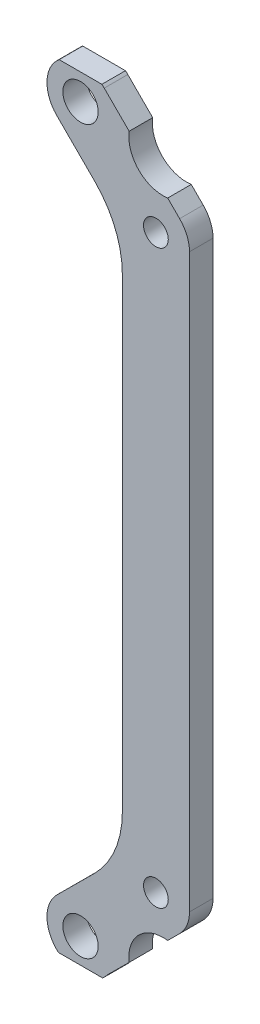
ISO-10303-21;
HEADER;
FILE_DESCRIPTION(('STEP AP214'),'2;1');
FILE_NAME('part.step','',(''),(''),'','','');
FILE_SCHEMA(('AUTOMOTIVE_DESIGN { 1 0 10303 214 1 1 1 1 }'));
ENDSEC;
DATA;
#1=APPLICATION_CONTEXT('core data for automotive mechanical design processes');
#2=APPLICATION_PROTOCOL_DEFINITION('international standard','automotive_design',2000,#1);
#3=PRODUCT_CONTEXT('',#1,'mechanical');
#4=PRODUCT('Part','Part','',(#3));
#5=PRODUCT_RELATED_PRODUCT_CATEGORY('part','',(#4));
#6=PRODUCT_DEFINITION_FORMATION('','',#4);
#7=PRODUCT_DEFINITION_CONTEXT('part definition',#1,'design');
#8=PRODUCT_DEFINITION('design','',#6,#7);
#9=PRODUCT_DEFINITION_SHAPE('','',#8);
#10=(LENGTH_UNIT() NAMED_UNIT(*) SI_UNIT(.MILLI.,.METRE.));
#11=(NAMED_UNIT(*) PLANE_ANGLE_UNIT() SI_UNIT($,.RADIAN.));
#12=(NAMED_UNIT(*) SI_UNIT($,.STERADIAN.) SOLID_ANGLE_UNIT());
#13=UNCERTAINTY_MEASURE_WITH_UNIT(LENGTH_MEASURE(1.E-05),#10,'distance_accuracy_value','');
#14=(GEOMETRIC_REPRESENTATION_CONTEXT(3) GLOBAL_UNCERTAINTY_ASSIGNED_CONTEXT((#13)) GLOBAL_UNIT_ASSIGNED_CONTEXT((#10,
#11,#12)) REPRESENTATION_CONTEXT('',''));
#15=CARTESIAN_POINT('',(0.,0.,0.));
#16=DIRECTION('',(0.,0.,1.));
#17=DIRECTION('',(1.,0.,0.));
#18=AXIS2_PLACEMENT_3D('',#15,#16,#17);
#19=CARTESIAN_POINT('',(43.5738675976098,-31.0495528823525,2.));
#20=DIRECTION('',(0.,0.,-1.));
#21=DIRECTION('',(-1.,0.,0.));
#22=AXIS2_PLACEMENT_3D('',#19,#20,#21);
#23=CYLINDRICAL_SURFACE('',#22,2.85);
#24=CARTESIAN_POINT('',(43.5738675976098,-31.0495528823525,2.));
#25=DIRECTION('',(0.,0.,1.));
#26=DIRECTION('',(1.,0.,0.));
#27=AXIS2_PLACEMENT_3D('',#24,#25,#26);
#28=CIRCLE('',#27,2.85);
#29=CARTESIAN_POINT('',(45.4495833368332,-33.19529062626,2.));
#30=VERTEX_POINT('',#29);
#31=CARTESIAN_POINT('',(45.8565070510267,-32.7560279409761,2.));
#32=VERTEX_POINT('',#31);
#33=EDGE_CURVE('E211',#30,#32,#28,.T.);
#34=ORIENTED_EDGE('',*,*,#33,.F.);
#35=DIRECTION('',(0.,0.,-1.));
#36=VECTOR('',#35,1.);
#37=CARTESIAN_POINT('',(45.4495833368332,-33.19529062626,2.));
#38=LINE('',#37,#36);
#39=CARTESIAN_POINT('',(45.4495833368332,-33.19529062626,0.));
#40=VERTEX_POINT('',#39);
#41=EDGE_CURVE('E12',#30,#40,#38,.T.);
#42=ORIENTED_EDGE('',*,*,#41,.T.);
#43=CARTESIAN_POINT('',(43.5738675976098,-31.0495528823525,0.));
#44=DIRECTION('',(0.,0.,1.));
#45=DIRECTION('',(1.,0.,0.));
#46=AXIS2_PLACEMENT_3D('',#43,#44,#45);
#47=CIRCLE('',#46,2.85);
#48=CARTESIAN_POINT('',(45.8565070510267,-32.7560279409761,0.));
#49=VERTEX_POINT('',#48);
#50=EDGE_CURVE('E205',#40,#49,#47,.T.);
#51=ORIENTED_EDGE('',*,*,#50,.T.);
#52=DIRECTION('',(0.,0.,-1.));
#53=VECTOR('',#52,1.);
#54=CARTESIAN_POINT('',(45.8565070510267,-32.7560279409761,2.));
#55=LINE('',#54,#53);
#56=EDGE_CURVE('E218',#49,#32,#55,.F.);
#57=ORIENTED_EDGE('',*,*,#56,.T.);
#58=EDGE_LOOP('',(#34,#42,#51,#57));
#59=FACE_BOUND('',#58,.T.);
#60=ADVANCED_FACE('F56',(#59),#23,.T.);
#61=CARTESIAN_POINT('',(43.5738675976098,30.2904471176475,2.));
#62=DIRECTION('',(0.,0.,-1.));
#63=DIRECTION('',(-1.,0.,0.));
#64=AXIS2_PLACEMENT_3D('',#61,#62,#63);
#65=CYLINDRICAL_SURFACE('',#64,2.85);
#66=CARTESIAN_POINT('',(43.5738675976098,30.2904471176475,2.));
#67=DIRECTION('',(0.,0.,1.));
#68=DIRECTION('',(1.,0.,0.));
#69=AXIS2_PLACEMENT_3D('',#66,#67,#68);
#70=CIRCLE('',#69,2.85);
#71=CARTESIAN_POINT('',(41.7590941210451,32.4879678180636,2.));
#72=VERTEX_POINT('',#71);
#73=CARTESIAN_POINT('',(41.5623623184378,28.2714507055993,2.));
#74=VERTEX_POINT('',#73);
#75=EDGE_CURVE('E287',#72,#74,#70,.T.);
#76=ORIENTED_EDGE('',*,*,#75,.F.);
#77=DIRECTION('',(0.,0.,-1.));
#78=VECTOR('',#77,1.);
#79=CARTESIAN_POINT('',(41.7590941210451,32.4879678180636,2.));
#80=LINE('',#79,#78);
#81=CARTESIAN_POINT('',(41.7590941210451,32.4879678180636,0.));
#82=VERTEX_POINT('',#81);
#83=EDGE_CURVE('E196',#72,#82,#80,.T.);
#84=ORIENTED_EDGE('',*,*,#83,.T.);
#85=CARTESIAN_POINT('',(43.5738675976098,30.2904471176475,0.));
#86=DIRECTION('',(0.,0.,1.));
#87=DIRECTION('',(1.,0.,0.));
#88=AXIS2_PLACEMENT_3D('',#85,#86,#87);
#89=CIRCLE('',#88,2.85);
#90=CARTESIAN_POINT('',(41.5623623184378,28.2714507055993,0.));
#91=VERTEX_POINT('',#90);
#92=EDGE_CURVE('E285',#82,#91,#89,.T.);
#93=ORIENTED_EDGE('',*,*,#92,.T.);
#94=DIRECTION('',(0.,0.,-1.));
#95=VECTOR('',#94,1.);
#96=CARTESIAN_POINT('',(41.5623623184378,28.2714507055993,2.));
#97=LINE('',#96,#95);
#98=EDGE_CURVE('E356',#74,#91,#97,.T.);
#99=ORIENTED_EDGE('',*,*,#98,.F.);
#100=EDGE_LOOP('',(#76,#84,#93,#99));
#101=FACE_BOUND('',#100,.T.);
#102=ADVANCED_FACE('F283',(#101),#65,.T.);
#103=CARTESIAN_POINT('',(39.1506076425324,-39.416663632518,2.));
#104=DIRECTION('',(0.704708232186591,-0.709497221621375,0.));
#105=DIRECTION('',(0.709497221621375,0.704708232186591,0.));
#106=AXIS2_PLACEMENT_3D('',#103,#104,#105);
#107=PLANE('',#106);
#108=DIRECTION('',(0.,0.,-1.));
#109=VECTOR('',#108,1.);
#110=CARTESIAN_POINT('',(47.698469833806,-30.926498103721,2.));
#111=LINE('',#110,#109);
#112=CARTESIAN_POINT('',(47.698469833806,-30.926498103721,2.));
#113=VERTEX_POINT('',#112);
#114=CARTESIAN_POINT('',(47.698469833806,-30.926498103721,0.));
#115=VERTEX_POINT('',#114);
#116=EDGE_CURVE('E390',#113,#115,#111,.T.);
#117=ORIENTED_EDGE('',*,*,#116,.F.);
#118=DIRECTION('',(-0.709497221621375,-0.704708232186591,0.));
#119=VECTOR('',#118,1.);
#120=CARTESIAN_POINT('',(39.1506076425324,-39.416663632518,2.));
#121=LINE('',#120,#119);
#122=EDGE_CURVE('E236',#113,#32,#121,.T.);
#123=ORIENTED_EDGE('',*,*,#122,.T.);
#124=ORIENTED_EDGE('',*,*,#56,.F.);
#125=DIRECTION('',(-0.709497221621375,-0.704708232186591,0.));
#126=VECTOR('',#125,1.);
#127=CARTESIAN_POINT('',(39.1506076425324,-39.416663632518,0.));
#128=LINE('',#127,#126);
#129=EDGE_CURVE('E231',#115,#49,#128,.T.);
#130=ORIENTED_EDGE('',*,*,#129,.F.);
#131=EDGE_LOOP('',(#117,#123,#124,#130));
#132=FACE_BOUND('',#131,.T.);
#133=ADVANCED_FACE('F389',(#132),#107,.T.);
#134=CARTESIAN_POINT('',(38.9474116840103,38.9474116840103,2.));
#135=DIRECTION('',(-0.707106781186547,-0.707106781186547,0.));
#136=DIRECTION('',(0.707106781186548,-0.707106781186548,0.));
#137=AXIS2_PLACEMENT_3D('',#134,#135,#136);
#138=PLANE('',#137);
#139=DIRECTION('',(-0.707106781186548,0.707106781186548,0.));
#140=VECTOR('',#139,1.);
#141=CARTESIAN_POINT('',(38.9474116840103,38.9474116840103,2.));
#142=LINE('',#141,#140);
#143=CARTESIAN_POINT('',(47.7019282514283,30.1928951165923,2.));
#144=VERTEX_POINT('',#143);
#145=CARTESIAN_POINT('',(45.5891219239914,32.3057014440292,2.));
#146=VERTEX_POINT('',#145);
#147=EDGE_CURVE('E328',#144,#146,#142,.T.);
#148=ORIENTED_EDGE('',*,*,#147,.F.);
#149=DIRECTION('',(0.,0.,-1.));
#150=VECTOR('',#149,1.);
#151=CARTESIAN_POINT('',(47.7019282514283,30.1928951165923,2.));
#152=LINE('',#151,#150);
#153=CARTESIAN_POINT('',(47.7019282514283,30.1928951165923,0.));
#154=VERTEX_POINT('',#153);
#155=EDGE_CURVE('E243',#144,#154,#152,.T.);
#156=ORIENTED_EDGE('',*,*,#155,.T.);
#157=DIRECTION('',(-0.707106781186548,0.707106781186548,0.));
#158=VECTOR('',#157,1.);
#159=CARTESIAN_POINT('',(38.9474116840103,38.9474116840103,0.));
#160=LINE('',#159,#158);
#161=CARTESIAN_POINT('',(45.5891219239914,32.3057014440292,0.));
#162=VERTEX_POINT('',#161);
#163=EDGE_CURVE('E339',#154,#162,#160,.T.);
#164=ORIENTED_EDGE('',*,*,#163,.T.);
#165=DIRECTION('',(0.,0.,-1.));
#166=VECTOR('',#165,1.);
#167=CARTESIAN_POINT('',(45.5891219239914,32.3057014440292,2.));
#168=LINE('',#167,#166);
#169=EDGE_CURVE('E353',#146,#162,#168,.T.);
#170=ORIENTED_EDGE('',*,*,#169,.F.);
#171=EDGE_LOOP('',(#148,#156,#164,#170));
#172=FACE_BOUND('',#171,.T.);
#173=ADVANCED_FACE('F423',(#172),#138,.F.);
#174=DIRECTION('',(0.,0.,-1.));
#175=VECTOR('',#174,1.);
#176=CARTESIAN_POINT('',(50.970278135918,-27.6767739689799,2.));
#177=LINE('',#176,#175);
#178=CARTESIAN_POINT('',(50.970278135918,-27.6767739689799,0.));
#179=VERTEX_POINT('',#178);
#180=CARTESIAN_POINT('',(50.970278135918,-27.6767739689799,2.));
#181=VERTEX_POINT('',#180);
#182=EDGE_CURVE('E394',#179,#181,#177,.F.);
#183=ORIENTED_EDGE('',*,*,#182,.F.);
#184=CARTESIAN_POINT('',(51.9754271636713,-26.6784095316768,0.));
#185=VERTEX_POINT('',#184);
#186=EDGE_CURVE('E227',#185,#179,#128,.T.);
#187=ORIENTED_EDGE('',*,*,#186,.F.);
#188=DIRECTION('',(0.,0.,-1.));
#189=VECTOR('',#188,1.);
#190=CARTESIAN_POINT('',(51.9754271636718,-26.6784095316763,2.));
#191=LINE('',#190,#189);
#192=CARTESIAN_POINT('',(51.9754271636713,-26.6784095316768,2.));
#193=VERTEX_POINT('',#192);
#194=EDGE_CURVE('E222',#185,#193,#191,.F.);
#195=ORIENTED_EDGE('',*,*,#194,.T.);
#196=EDGE_CURVE('E232',#193,#181,#121,.T.);
#197=ORIENTED_EDGE('',*,*,#196,.T.);
#198=EDGE_LOOP('',(#183,#187,#195,#197));
#199=FACE_BOUND('',#198,.T.);
#200=ADVANCED_FACE('F398',(#199),#107,.T.);
#201=CARTESIAN_POINT('',(43.5738675976098,-31.0495528823525,2.));
#202=DIRECTION('',(0.,0.,1.));
#203=DIRECTION('',(1.,0.,0.));
#204=AXIS2_PLACEMENT_3D('',#201,#202,#203);
#205=PLANE('',#204);
#206=DIRECTION('',(-1.,0.,0.));
#207=VECTOR('',#206,1.);
#208=CARTESIAN_POINT('',(43.5738675976098,-33.19529062626,2.));
#209=LINE('',#208,#207);
#210=CARTESIAN_POINT('',(41.6981518583863,-33.19529062626,2.));
#211=VERTEX_POINT('',#210);
#212=EDGE_CURVE('E71',#30,#211,#209,.T.);
#213=ORIENTED_EDGE('',*,*,#212,.F.);
#214=ORIENTED_EDGE('',*,*,#33,.T.);
#215=ORIENTED_EDGE('',*,*,#122,.F.);
#216=CARTESIAN_POINT('',(50.5738675976098,-30.5495528823525,2.));
#217=DIRECTION('',(0.,0.,-1.));
#218=DIRECTION('',(-1.,0.,0.));
#219=AXIS2_PLACEMENT_3D('',#216,#217,#218);
#220=CIRCLE('',#219,2.9);
#221=EDGE_CURVE('E253',#113,#181,#220,.T.);
#222=ORIENTED_EDGE('',*,*,#221,.T.);
#223=ORIENTED_EDGE('',*,*,#196,.F.);
#224=CARTESIAN_POINT('',(49.9738675976098,-24.6495528823525,2.));
#225=DIRECTION('',(0.,0.,-1.));
#226=DIRECTION('',(-1.,0.,0.));
#227=AXIS2_PLACEMENT_3D('',#224,#225,#226);
#228=CIRCLE('',#227,2.85);
#229=CARTESIAN_POINT('',(52.8238675976098,-24.6495528823525,2.));
#230=VERTEX_POINT('',#229);
#231=EDGE_CURVE('E235',#230,#193,#228,.T.);
#232=ORIENTED_EDGE('',*,*,#231,.F.);
#233=DIRECTION('',(0.,1.,0.));
#234=VECTOR('',#233,1.);
#235=CARTESIAN_POINT('',(52.8238675976098,0.,2.));
#236=LINE('',#235,#234);
#237=CARTESIAN_POINT('',(52.8238675976098,23.8904471176475,2.));
#238=VERTEX_POINT('',#237);
#239=EDGE_CURVE('E332',#230,#238,#236,.T.);
#240=ORIENTED_EDGE('',*,*,#239,.T.);
#241=CARTESIAN_POINT('',(49.9738675976098,23.8904471176475,2.));
#242=DIRECTION('',(0.,0.,1.));
#243=DIRECTION('',(1.,0.,0.));
#244=AXIS2_PLACEMENT_3D('',#241,#242,#243);
#245=CIRCLE('',#244,2.85);
#246=CARTESIAN_POINT('',(51.9891219239914,25.9057014440292,2.));
#247=VERTEX_POINT('',#246);
#248=EDGE_CURVE('E312',#238,#247,#245,.T.);
#249=ORIENTED_EDGE('',*,*,#248,.T.);
#250=CARTESIAN_POINT('',(50.9763155965546,26.918507771466,2.));
#251=VERTEX_POINT('',#250);
#252=EDGE_CURVE('E329',#247,#251,#142,.T.);
#253=ORIENTED_EDGE('',*,*,#252,.T.);
#254=CARTESIAN_POINT('',(50.5738675976098,29.7904471176475,2.));
#255=DIRECTION('',(0.,0.,-1.));
#256=DIRECTION('',(-1.,0.,0.));
#257=AXIS2_PLACEMENT_3D('',#254,#255,#256);
#258=CIRCLE('',#257,2.9);
#259=EDGE_CURVE('E296',#251,#144,#258,.T.);
#260=ORIENTED_EDGE('',*,*,#259,.T.);
#261=ORIENTED_EDGE('',*,*,#147,.T.);
#262=CARTESIAN_POINT('',(45.3886410741744,32.4879678180636,2.));
#263=VERTEX_POINT('',#262);
#264=EDGE_CURVE('E303',#146,#263,#70,.T.);
#265=ORIENTED_EDGE('',*,*,#264,.T.);
#266=DIRECTION('',(1.,0.,0.));
#267=VECTOR('',#266,1.);
#268=CARTESIAN_POINT('',(43.5738675976098,32.4879678180636,2.));
#269=LINE('',#268,#267);
#270=EDGE_CURVE('E79',#72,#263,#269,.T.);
#271=ORIENTED_EDGE('',*,*,#270,.F.);
#272=ORIENTED_EDGE('',*,*,#75,.T.);
#273=DIRECTION('',(-0.707106396386645,0.707107165986241,0.));
#274=VECTOR('',#273,1.);
#275=CARTESIAN_POINT('',(34.9169291297944,34.9168911269912,2.));
#276=LINE('',#275,#274);
#277=CARTESIAN_POINT('',(44.7807249254997,25.0530845957399,2.));
#278=VERTEX_POINT('',#277);
#279=EDGE_CURVE('E325',#278,#74,#276,.T.);
#280=ORIENTED_EDGE('',*,*,#279,.F.);
#281=CARTESIAN_POINT('',(39.1238675976098,19.3962334246467,2.));
#282=DIRECTION('',(0.,0.,1.));
#283=DIRECTION('',(1.,0.,0.));
#284=AXIS2_PLACEMENT_3D('',#281,#282,#283);
#285=CIRCLE('',#284,8.);
#286=CARTESIAN_POINT('',(47.1238675976098,19.3962334246467,2.));
#287=VERTEX_POINT('',#286);
#288=EDGE_CURVE('E265',#278,#287,#285,.F.);
#289=ORIENTED_EDGE('',*,*,#288,.T.);
#290=DIRECTION('',(0.,1.,0.));
#291=VECTOR('',#290,1.);
#292=CARTESIAN_POINT('',(47.1238675976098,0.,2.));
#293=LINE('',#292,#291);
#294=CARTESIAN_POINT('',(47.1238675976098,-20.1672643470321,2.));
#295=VERTEX_POINT('',#294);
#296=EDGE_CURVE('E323',#295,#287,#293,.T.);
#297=ORIENTED_EDGE('',*,*,#296,.F.);
#298=CARTESIAN_POINT('',(39.1238675976098,-20.1672643470321,2.));
#299=DIRECTION('',(0.,0.,1.));
#300=DIRECTION('',(1.,0.,0.));
#301=AXIS2_PLACEMENT_3D('',#298,#299,#300);
#302=CIRCLE('',#301,8.);
#303=CARTESIAN_POINT('',(44.7701982058117,-25.8346226966411,2.));
#304=VERTEX_POINT('',#303);
#305=EDGE_CURVE('E275',#295,#304,#302,.F.);
#306=ORIENTED_EDGE('',*,*,#305,.T.);
#307=DIRECTION('',(0.708419793701119,0.705791326025238,0.));
#308=VECTOR('',#307,1.);
#309=CARTESIAN_POINT('',(35.2191111332785,-35.3502721319669,2.));
#310=LINE('',#309,#308);
#311=CARTESIAN_POINT('',(41.5623623184378,-29.0305564703043,2.));
#312=VERTEX_POINT('',#311);
#313=EDGE_CURVE('E239',#312,#304,#310,.T.);
#314=ORIENTED_EDGE('',*,*,#313,.F.);
#315=EDGE_CURVE('E213',#312,#211,#28,.T.);
#316=ORIENTED_EDGE('',*,*,#315,.T.);
#317=EDGE_LOOP('',(#213,#214,#215,#222,#223,#232,#240,#249,#253,#260,#261,#265,#271,#272,#280,
#289,#297,#306,#314,#316));
#318=FACE_BOUND('',#317,.T.);
#319=CARTESIAN_POINT('',(43.5738675976098,30.2904471176475,2.));
#320=DIRECTION('',(0.,0.,1.));
#321=DIRECTION('',(1.,0.,0.));
#322=AXIS2_PLACEMENT_3D('',#319,#320,#321);
#323=CIRCLE('',#322,1.5);
#324=CARTESIAN_POINT('',(45.0738675976098,30.2904471176475,2.));
#325=VERTEX_POINT('',#324);
#326=EDGE_CURVE('E258',#325,#325,#323,.T.);
#327=ORIENTED_EDGE('',*,*,#326,.F.);
#328=EDGE_LOOP('',(#327));
#329=FACE_BOUND('',#328,.T.);
#330=CARTESIAN_POINT('',(43.5738675976098,-31.0495528823525,2.));
#331=DIRECTION('',(0.,0.,1.));
#332=DIRECTION('',(1.,0.,0.));
#333=AXIS2_PLACEMENT_3D('',#330,#331,#332);
#334=CIRCLE('',#333,1.5);
#335=CARTESIAN_POINT('',(45.0738675976098,-31.0495528823525,2.));
#336=VERTEX_POINT('',#335);
#337=EDGE_CURVE('E254',#336,#336,#334,.T.);
#338=ORIENTED_EDGE('',*,*,#337,.F.);
#339=EDGE_LOOP('',(#338));
#340=FACE_BOUND('',#339,.T.);
#341=CARTESIAN_POINT('',(49.9738675976098,-24.6495528823525,2.));
#342=DIRECTION('',(0.,0.,1.));
#343=DIRECTION('',(1.,0.,0.));
#344=AXIS2_PLACEMENT_3D('',#341,#342,#343);
#345=CIRCLE('',#344,1.05);
#346=CARTESIAN_POINT('',(51.0238675976098,-24.6495528823525,2.));
#347=VERTEX_POINT('',#346);
#348=EDGE_CURVE('E226',#347,#347,#345,.T.);
#349=ORIENTED_EDGE('',*,*,#348,.F.);
#350=EDGE_LOOP('',(#349));
#351=FACE_BOUND('',#350,.T.);
#352=CARTESIAN_POINT('',(49.9738675976098,23.8904471176475,2.));
#353=DIRECTION('',(0.,0.,1.));
#354=DIRECTION('',(1.,0.,0.));
#355=AXIS2_PLACEMENT_3D('',#352,#353,#354);
#356=CIRCLE('',#355,1.05);
#357=CARTESIAN_POINT('',(51.0238675976098,23.8904471176475,2.));
#358=VERTEX_POINT('',#357);
#359=EDGE_CURVE('E305',#358,#358,#356,.T.);
#360=ORIENTED_EDGE('',*,*,#359,.F.);
#361=EDGE_LOOP('',(#360));
#362=FACE_BOUND('',#361,.T.);
#363=ADVANCED_FACE('F363',(#318,#329,#340,#351,#362),#205,.T.);
#364=CARTESIAN_POINT('',(43.5738675976098,-31.0495528823525,0.));
#365=DIRECTION('',(0.,0.,1.));
#366=DIRECTION('',(1.,0.,0.));
#367=AXIS2_PLACEMENT_3D('',#364,#365,#366);
#368=PLANE('',#367);
#369=CARTESIAN_POINT('',(43.5738675976098,30.2904471176475,0.));
#370=DIRECTION('',(0.,0.,1.));
#371=DIRECTION('',(1.,0.,0.));
#372=AXIS2_PLACEMENT_3D('',#369,#370,#371);
#373=CIRCLE('',#372,1.5);
#374=CARTESIAN_POINT('',(45.0738675976098,30.2904471176475,0.));
#375=VERTEX_POINT('',#374);
#376=EDGE_CURVE('E255',#375,#375,#373,.T.);
#377=ORIENTED_EDGE('',*,*,#376,.T.);
#378=EDGE_LOOP('',(#377));
#379=FACE_BOUND('',#378,.T.);
#380=CARTESIAN_POINT('',(43.5738675976098,-31.0495528823525,0.));
#381=DIRECTION('',(0.,0.,1.));
#382=DIRECTION('',(1.,0.,0.));
#383=AXIS2_PLACEMENT_3D('',#380,#381,#382);
#384=CIRCLE('',#383,1.5);
#385=CARTESIAN_POINT('',(45.0738675976098,-31.0495528823525,0.));
#386=VERTEX_POINT('',#385);
#387=EDGE_CURVE('E250',#386,#386,#384,.T.);
#388=ORIENTED_EDGE('',*,*,#387,.T.);
#389=EDGE_LOOP('',(#388));
#390=FACE_BOUND('',#389,.T.);
#391=ORIENTED_EDGE('',*,*,#50,.F.);
#392=DIRECTION('',(1.,0.,0.));
#393=VECTOR('',#392,1.);
#394=CARTESIAN_POINT('',(48.0156538394514,-33.19529062626,0.));
#395=LINE('',#394,#393);
#396=CARTESIAN_POINT('',(41.6981518583863,-33.19529062626,0.));
#397=VERTEX_POINT('',#396);
#398=EDGE_CURVE('E192',#397,#40,#395,.T.);
#399=ORIENTED_EDGE('',*,*,#398,.F.);
#400=CARTESIAN_POINT('',(41.5623623184378,-29.0305564703043,0.));
#401=VERTEX_POINT('',#400);
#402=EDGE_CURVE('E202',#401,#397,#47,.T.);
#403=ORIENTED_EDGE('',*,*,#402,.F.);
#404=DIRECTION('',(0.708419793701119,0.705791326025238,0.));
#405=VECTOR('',#404,1.);
#406=CARTESIAN_POINT('',(35.2191111332785,-35.3502721319669,0.));
#407=LINE('',#406,#405);
#408=CARTESIAN_POINT('',(44.7701982058117,-25.8346226966411,0.));
#409=VERTEX_POINT('',#408);
#410=EDGE_CURVE('E225',#401,#409,#407,.T.);
#411=ORIENTED_EDGE('',*,*,#410,.T.);
#412=CARTESIAN_POINT('',(39.1238675976098,-20.1672643470321,0.));
#413=DIRECTION('',(0.,0.,1.));
#414=DIRECTION('',(1.,0.,0.));
#415=AXIS2_PLACEMENT_3D('',#412,#413,#414);
#416=CIRCLE('',#415,8.);
#417=CARTESIAN_POINT('',(47.1238675976098,-20.1672643470321,0.));
#418=VERTEX_POINT('',#417);
#419=EDGE_CURVE('E273',#409,#418,#416,.T.);
#420=ORIENTED_EDGE('',*,*,#419,.T.);
#421=DIRECTION('',(0.,1.,0.));
#422=VECTOR('',#421,1.);
#423=CARTESIAN_POINT('',(47.1238675976098,0.,0.));
#424=LINE('',#423,#422);
#425=CARTESIAN_POINT('',(47.1238675976098,19.3962334246467,0.));
#426=VERTEX_POINT('',#425);
#427=EDGE_CURVE('E336',#418,#426,#424,.T.);
#428=ORIENTED_EDGE('',*,*,#427,.T.);
#429=CARTESIAN_POINT('',(39.1238675976098,19.3962334246467,0.));
#430=DIRECTION('',(0.,0.,1.));
#431=DIRECTION('',(1.,0.,0.));
#432=AXIS2_PLACEMENT_3D('',#429,#430,#431);
#433=CIRCLE('',#432,8.);
#434=CARTESIAN_POINT('',(44.7807249254997,25.0530845957399,0.));
#435=VERTEX_POINT('',#434);
#436=EDGE_CURVE('E263',#426,#435,#433,.T.);
#437=ORIENTED_EDGE('',*,*,#436,.T.);
#438=DIRECTION('',(-0.707106396386645,0.707107165986241,0.));
#439=VECTOR('',#438,1.);
#440=CARTESIAN_POINT('',(34.9169291297944,34.9168911269912,0.));
#441=LINE('',#440,#439);
#442=EDGE_CURVE('E293',#435,#91,#441,.T.);
#443=ORIENTED_EDGE('',*,*,#442,.T.);
#444=ORIENTED_EDGE('',*,*,#92,.F.);
#445=DIRECTION('',(-1.,0.,0.));
#446=VECTOR('',#445,1.);
#447=CARTESIAN_POINT('',(47.130867933701,32.4879678180636,0.));
#448=LINE('',#447,#446);
#449=CARTESIAN_POINT('',(45.3886410741744,32.4879678180636,0.));
#450=VERTEX_POINT('',#449);
#451=EDGE_CURVE('E290',#450,#82,#448,.T.);
#452=ORIENTED_EDGE('',*,*,#451,.F.);
#453=EDGE_CURVE('E295',#162,#450,#89,.T.);
#454=ORIENTED_EDGE('',*,*,#453,.F.);
#455=ORIENTED_EDGE('',*,*,#163,.F.);
#456=CARTESIAN_POINT('',(50.5738675976098,29.7904471176475,0.));
#457=DIRECTION('',(0.,0.,-1.));
#458=DIRECTION('',(-1.,0.,0.));
#459=AXIS2_PLACEMENT_3D('',#456,#457,#458);
#460=CIRCLE('',#459,2.9);
#461=CARTESIAN_POINT('',(50.9763155965546,26.918507771466,0.));
#462=VERTEX_POINT('',#461);
#463=EDGE_CURVE('E299',#462,#154,#460,.T.);
#464=ORIENTED_EDGE('',*,*,#463,.F.);
#465=CARTESIAN_POINT('',(51.9891219239914,25.9057014440292,0.));
#466=VERTEX_POINT('',#465);
#467=EDGE_CURVE('E340',#466,#462,#160,.T.);
#468=ORIENTED_EDGE('',*,*,#467,.F.);
#469=CARTESIAN_POINT('',(49.9738675976098,23.8904471176475,0.));
#470=DIRECTION('',(0.,0.,1.));
#471=DIRECTION('',(1.,0.,0.));
#472=AXIS2_PLACEMENT_3D('',#469,#470,#471);
#473=CIRCLE('',#472,2.85);
#474=CARTESIAN_POINT('',(52.8238675976098,23.8904471176475,0.));
#475=VERTEX_POINT('',#474);
#476=EDGE_CURVE('E308',#475,#466,#473,.T.);
#477=ORIENTED_EDGE('',*,*,#476,.F.);
#478=DIRECTION('',(0.,1.,0.));
#479=VECTOR('',#478,1.);
#480=CARTESIAN_POINT('',(52.8238675976098,0.,0.));
#481=LINE('',#480,#479);
#482=CARTESIAN_POINT('',(52.8238675976098,-24.6495528823525,0.));
#483=VERTEX_POINT('',#482);
#484=EDGE_CURVE('E343',#483,#475,#481,.T.);
#485=ORIENTED_EDGE('',*,*,#484,.F.);
#486=CARTESIAN_POINT('',(49.9738675976098,-24.6495528823525,0.));
#487=DIRECTION('',(0.,0.,1.));
#488=DIRECTION('',(1.,0.,0.));
#489=AXIS2_PLACEMENT_3D('',#486,#487,#488);
#490=CIRCLE('',#489,2.85);
#491=EDGE_CURVE('E230',#483,#185,#490,.F.);
#492=ORIENTED_EDGE('',*,*,#491,.T.);
#493=ORIENTED_EDGE('',*,*,#186,.T.);
#494=CARTESIAN_POINT('',(50.5738675976098,-30.5495528823525,0.));
#495=DIRECTION('',(0.,0.,1.));
#496=DIRECTION('',(1.,0.,0.));
#497=AXIS2_PLACEMENT_3D('',#494,#495,#496);
#498=CIRCLE('',#497,2.9);
#499=EDGE_CURVE('E246',#179,#115,#498,.T.);
#500=ORIENTED_EDGE('',*,*,#499,.T.);
#501=ORIENTED_EDGE('',*,*,#129,.T.);
#502=EDGE_LOOP('',(#391,#399,#403,#411,#420,#428,#437,#443,#444,#452,#454,#455,#464,#468,#477,
#485,#492,#493,#500,#501));
#503=FACE_BOUND('',#502,.T.);
#504=CARTESIAN_POINT('',(49.9738675976098,-24.6495528823525,0.));
#505=DIRECTION('',(0.,0.,1.));
#506=DIRECTION('',(1.,0.,0.));
#507=AXIS2_PLACEMENT_3D('',#504,#505,#506);
#508=CIRCLE('',#507,1.05);
#509=CARTESIAN_POINT('',(51.0238675976098,-24.6495528823525,0.));
#510=VERTEX_POINT('',#509);
#511=EDGE_CURVE('E315',#510,#510,#508,.T.);
#512=ORIENTED_EDGE('',*,*,#511,.T.);
#513=EDGE_LOOP('',(#512));
#514=FACE_BOUND('',#513,.T.);
#515=CARTESIAN_POINT('',(49.9738675976098,23.8904471176475,0.));
#516=DIRECTION('',(0.,0.,1.));
#517=DIRECTION('',(1.,0.,0.));
#518=AXIS2_PLACEMENT_3D('',#515,#516,#517);
#519=CIRCLE('',#518,1.05);
#520=CARTESIAN_POINT('',(51.0238675976098,23.8904471176475,0.));
#521=VERTEX_POINT('',#520);
#522=EDGE_CURVE('E309',#521,#521,#519,.T.);
#523=ORIENTED_EDGE('',*,*,#522,.T.);
#524=EDGE_LOOP('',(#523));
#525=FACE_BOUND('',#524,.T.);
#526=ADVANCED_FACE('F199',(#379,#390,#503,#514,#525),#368,.F.);
#527=ORIENTED_EDGE('',*,*,#402,.T.);
#528=DIRECTION('',(0.,0.,-1.));
#529=VECTOR('',#528,1.);
#530=CARTESIAN_POINT('',(41.6981518583863,-33.19529062626,2.));
#531=LINE('',#530,#529);
#532=EDGE_CURVE('E64',#397,#211,#531,.F.);
#533=ORIENTED_EDGE('',*,*,#532,.T.);
#534=ORIENTED_EDGE('',*,*,#315,.F.);
#535=DIRECTION('',(0.,0.,-1.));
#536=VECTOR('',#535,1.);
#537=CARTESIAN_POINT('',(41.5623623184378,-29.0305564703043,2.));
#538=LINE('',#537,#536);
#539=EDGE_CURVE('E209',#312,#401,#538,.T.);
#540=ORIENTED_EDGE('',*,*,#539,.T.);
#541=EDGE_LOOP('',(#527,#533,#534,#540));
#542=FACE_BOUND('',#541,.T.);
#543=ADVANCED_FACE('F207',(#542),#23,.T.);
#544=CARTESIAN_POINT('',(52.8238675976098,0.,2.));
#545=DIRECTION('',(-1.,0.,0.));
#546=DIRECTION('',(0.,0.,1.));
#547=AXIS2_PLACEMENT_3D('',#544,#545,#546);
#548=PLANE('',#547);
#549=ORIENTED_EDGE('',*,*,#484,.T.);
#550=DIRECTION('',(0.,0.,-1.));
#551=VECTOR('',#550,1.);
#552=CARTESIAN_POINT('',(52.8238675976098,23.8904471176475,2.));
#553=LINE('',#552,#551);
#554=EDGE_CURVE('E348',#238,#475,#553,.T.);
#555=ORIENTED_EDGE('',*,*,#554,.F.);
#556=ORIENTED_EDGE('',*,*,#239,.F.);
#557=DIRECTION('',(0.,0.,-1.));
#558=VECTOR('',#557,1.);
#559=CARTESIAN_POINT('',(52.8238675976098,-24.6495528823525,2.));
#560=LINE('',#559,#558);
#561=EDGE_CURVE('E215',#230,#483,#560,.T.);
#562=ORIENTED_EDGE('',*,*,#561,.T.);
#563=EDGE_LOOP('',(#549,#555,#556,#562));
#564=FACE_BOUND('',#563,.T.);
#565=ADVANCED_FACE('F407',(#564),#548,.F.);
#566=ORIENTED_EDGE('',*,*,#467,.T.);
#567=DIRECTION('',(0.,0.,-1.));
#568=VECTOR('',#567,1.);
#569=CARTESIAN_POINT('',(50.9763155965546,26.918507771466,2.));
#570=LINE('',#569,#568);
#571=EDGE_CURVE('E221',#462,#251,#570,.F.);
#572=ORIENTED_EDGE('',*,*,#571,.T.);
#573=ORIENTED_EDGE('',*,*,#252,.F.);
#574=DIRECTION('',(0.,0.,-1.));
#575=VECTOR('',#574,1.);
#576=CARTESIAN_POINT('',(51.9891219239914,25.9057014440292,2.));
#577=LINE('',#576,#575);
#578=EDGE_CURVE('E350',#247,#466,#577,.T.);
#579=ORIENTED_EDGE('',*,*,#578,.T.);
#580=EDGE_LOOP('',(#566,#572,#573,#579));
#581=FACE_BOUND('',#580,.T.);
#582=ADVANCED_FACE('F416',(#581),#138,.F.);
#583=CARTESIAN_POINT('',(34.9169291297944,34.9168911269912,2.));
#584=DIRECTION('',(-0.707107165986241,-0.707106396386645,0.));
#585=DIRECTION('',(0.707106396386645,-0.707107165986241,0.));
#586=AXIS2_PLACEMENT_3D('',#583,#584,#585);
#587=PLANE('',#586);
#588=ORIENTED_EDGE('',*,*,#442,.F.);
#589=DIRECTION('',(0.,0.,-1.));
#590=VECTOR('',#589,1.);
#591=CARTESIAN_POINT('',(44.7807249254997,25.0530845957399,2.));
#592=LINE('',#591,#590);
#593=EDGE_CURVE('E261',#435,#278,#592,.F.);
#594=ORIENTED_EDGE('',*,*,#593,.T.);
#595=ORIENTED_EDGE('',*,*,#279,.T.);
#596=ORIENTED_EDGE('',*,*,#98,.T.);
#597=EDGE_LOOP('',(#588,#594,#595,#596));
#598=FACE_BOUND('',#597,.T.);
#599=ADVANCED_FACE('F358',(#598),#587,.T.);
#600=CARTESIAN_POINT('',(47.1238675976098,0.,2.));
#601=DIRECTION('',(-1.,0.,0.));
#602=DIRECTION('',(0.,0.,1.));
#603=AXIS2_PLACEMENT_3D('',#600,#601,#602);
#604=PLANE('',#603);
#605=ORIENTED_EDGE('',*,*,#427,.F.);
#606=DIRECTION('',(0.,0.,-1.));
#607=VECTOR('',#606,1.);
#608=CARTESIAN_POINT('',(47.1238675976098,-20.1672643470321,2.));
#609=LINE('',#608,#607);
#610=EDGE_CURVE('E271',#418,#295,#609,.F.);
#611=ORIENTED_EDGE('',*,*,#610,.T.);
#612=ORIENTED_EDGE('',*,*,#296,.T.);
#613=DIRECTION('',(0.,0.,-1.));
#614=VECTOR('',#613,1.);
#615=CARTESIAN_POINT('',(47.1238675976098,19.3962334246467,0.));
#616=LINE('',#615,#614);
#617=EDGE_CURVE('E249',#287,#426,#616,.T.);
#618=ORIENTED_EDGE('',*,*,#617,.T.);
#619=EDGE_LOOP('',(#605,#611,#612,#618));
#620=FACE_BOUND('',#619,.T.);
#621=ADVANCED_FACE('F372',(#620),#604,.T.);
#622=CARTESIAN_POINT('',(35.2191111332785,-35.3502721319669,2.));
#623=DIRECTION('',(-0.705791326025238,0.708419793701119,0.));
#624=DIRECTION('',(-0.708419793701119,-0.705791326025238,0.));
#625=AXIS2_PLACEMENT_3D('',#622,#623,#624);
#626=PLANE('',#625);
#627=ORIENTED_EDGE('',*,*,#313,.T.);
#628=DIRECTION('',(0.,0.,-1.));
#629=VECTOR('',#628,1.);
#630=CARTESIAN_POINT('',(44.7701982058117,-25.8346226966411,0.));
#631=LINE('',#630,#629);
#632=EDGE_CURVE('E268',#304,#409,#631,.T.);
#633=ORIENTED_EDGE('',*,*,#632,.T.);
#634=ORIENTED_EDGE('',*,*,#410,.F.);
#635=ORIENTED_EDGE('',*,*,#539,.F.);
#636=EDGE_LOOP('',(#627,#633,#634,#635));
#637=FACE_BOUND('',#636,.T.);
#638=ADVANCED_FACE('F379',(#637),#626,.T.);
#639=CARTESIAN_POINT('',(49.9738675976098,-24.6495528823525,2.));
#640=DIRECTION('',(0.,0.,-1.));
#641=DIRECTION('',(-1.,0.,0.));
#642=AXIS2_PLACEMENT_3D('',#639,#640,#641);
#643=CYLINDRICAL_SURFACE('',#642,2.85);
#644=ORIENTED_EDGE('',*,*,#561,.F.);
#645=ORIENTED_EDGE('',*,*,#231,.T.);
#646=ORIENTED_EDGE('',*,*,#194,.F.);
#647=ORIENTED_EDGE('',*,*,#491,.F.);
#648=EDGE_LOOP('',(#644,#645,#646,#647));
#649=FACE_BOUND('',#648,.T.);
#650=ADVANCED_FACE('F402',(#649),#643,.T.);
#651=CARTESIAN_POINT('',(49.9738675976098,-24.6495528823525,2.));
#652=DIRECTION('',(0.,0.,-1.));
#653=DIRECTION('',(-1.,0.,0.));
#654=AXIS2_PLACEMENT_3D('',#651,#652,#653);
#655=CYLINDRICAL_SURFACE('',#654,1.05);
#656=ORIENTED_EDGE('',*,*,#348,.T.);
#657=EDGE_LOOP('',(#656));
#658=FACE_BOUND('',#657,.T.);
#659=ORIENTED_EDGE('',*,*,#511,.F.);
#660=EDGE_LOOP('',(#659));
#661=FACE_BOUND('',#660,.T.);
#662=ADVANCED_FACE('F477',(#658,#661),#655,.F.);
#663=CARTESIAN_POINT('',(49.9738675976098,23.8904471176475,2.));
#664=DIRECTION('',(0.,0.,-1.));
#665=DIRECTION('',(-1.,0.,0.));
#666=AXIS2_PLACEMENT_3D('',#663,#664,#665);
#667=CYLINDRICAL_SURFACE('',#666,2.85);
#668=ORIENTED_EDGE('',*,*,#554,.T.);
#669=ORIENTED_EDGE('',*,*,#476,.T.);
#670=ORIENTED_EDGE('',*,*,#578,.F.);
#671=ORIENTED_EDGE('',*,*,#248,.F.);
#672=EDGE_LOOP('',(#668,#669,#670,#671));
#673=FACE_BOUND('',#672,.T.);
#674=ADVANCED_FACE('F411',(#673),#667,.T.);
#675=CARTESIAN_POINT('',(49.9738675976098,23.8904471176475,2.));
#676=DIRECTION('',(0.,0.,-1.));
#677=DIRECTION('',(-1.,0.,0.));
#678=AXIS2_PLACEMENT_3D('',#675,#676,#677);
#679=CYLINDRICAL_SURFACE('',#678,1.05);
#680=ORIENTED_EDGE('',*,*,#359,.T.);
#681=EDGE_LOOP('',(#680));
#682=FACE_BOUND('',#681,.T.);
#683=ORIENTED_EDGE('',*,*,#522,.F.);
#684=EDGE_LOOP('',(#683));
#685=FACE_BOUND('',#684,.T.);
#686=ADVANCED_FACE('F444',(#682,#685),#679,.F.);
#687=ORIENTED_EDGE('',*,*,#453,.T.);
#688=DIRECTION('',(0.,0.,-1.));
#689=VECTOR('',#688,1.);
#690=CARTESIAN_POINT('',(45.3886410741744,32.4879678180636,2.));
#691=LINE('',#690,#689);
#692=EDGE_CURVE('E277',#450,#263,#691,.F.);
#693=ORIENTED_EDGE('',*,*,#692,.T.);
#694=ORIENTED_EDGE('',*,*,#264,.F.);
#695=ORIENTED_EDGE('',*,*,#169,.T.);
#696=EDGE_LOOP('',(#687,#693,#694,#695));
#697=FACE_BOUND('',#696,.T.);
#698=ADVANCED_FACE('F425',(#697),#65,.T.);
#699=CARTESIAN_POINT('',(50.5738675976098,29.7904471176475,2.));
#700=DIRECTION('',(0.,0.,-1.));
#701=DIRECTION('',(-1.,0.,0.));
#702=AXIS2_PLACEMENT_3D('',#699,#700,#701);
#703=CYLINDRICAL_SURFACE('',#702,2.9);
#704=ORIENTED_EDGE('',*,*,#259,.F.);
#705=ORIENTED_EDGE('',*,*,#571,.F.);
#706=ORIENTED_EDGE('',*,*,#463,.T.);
#707=ORIENTED_EDGE('',*,*,#155,.F.);
#708=EDGE_LOOP('',(#704,#705,#706,#707));
#709=FACE_BOUND('',#708,.T.);
#710=ADVANCED_FACE('F434',(#709),#703,.F.);
#711=CARTESIAN_POINT('',(50.5738675976098,-30.5495528823525,2.));
#712=DIRECTION('',(0.,0.,-1.));
#713=DIRECTION('',(-1.,0.,0.));
#714=AXIS2_PLACEMENT_3D('',#711,#712,#713);
#715=CYLINDRICAL_SURFACE('',#714,2.9);
#716=ORIENTED_EDGE('',*,*,#116,.T.);
#717=ORIENTED_EDGE('',*,*,#499,.F.);
#718=ORIENTED_EDGE('',*,*,#182,.T.);
#719=ORIENTED_EDGE('',*,*,#221,.F.);
#720=EDGE_LOOP('',(#716,#717,#718,#719));
#721=FACE_BOUND('',#720,.T.);
#722=ADVANCED_FACE('F436',(#721),#715,.F.);
#723=CARTESIAN_POINT('',(43.5738675976098,-31.0495528823525,-2.5));
#724=DIRECTION('',(0.,0.,1.));
#725=DIRECTION('',(1.,0.,0.));
#726=AXIS2_PLACEMENT_3D('',#723,#724,#725);
#727=CYLINDRICAL_SURFACE('',#726,1.5);
#728=ORIENTED_EDGE('',*,*,#337,.T.);
#729=EDGE_LOOP('',(#728));
#730=FACE_BOUND('',#729,.T.);
#731=ORIENTED_EDGE('',*,*,#387,.F.);
#732=EDGE_LOOP('',(#731));
#733=FACE_BOUND('',#732,.T.);
#734=ADVANCED_FACE('F442',(#730,#733),#727,.F.);
#735=CARTESIAN_POINT('',(43.5738675976098,30.2904471176475,-2.5));
#736=DIRECTION('',(0.,0.,1.));
#737=DIRECTION('',(1.,0.,0.));
#738=AXIS2_PLACEMENT_3D('',#735,#736,#737);
#739=CYLINDRICAL_SURFACE('',#738,1.5);
#740=ORIENTED_EDGE('',*,*,#326,.T.);
#741=EDGE_LOOP('',(#740));
#742=FACE_BOUND('',#741,.T.);
#743=ORIENTED_EDGE('',*,*,#376,.F.);
#744=EDGE_LOOP('',(#743));
#745=FACE_BOUND('',#744,.T.);
#746=ADVANCED_FACE('F527',(#742,#745),#739,.F.);
#747=CARTESIAN_POINT('',(39.1238675976098,19.3962334246467,2.));
#748=DIRECTION('',(0.,0.,1.));
#749=DIRECTION('',(1.,0.,0.));
#750=AXIS2_PLACEMENT_3D('',#747,#748,#749);
#751=CYLINDRICAL_SURFACE('',#750,8.);
#752=ORIENTED_EDGE('',*,*,#288,.F.);
#753=ORIENTED_EDGE('',*,*,#593,.F.);
#754=ORIENTED_EDGE('',*,*,#436,.F.);
#755=ORIENTED_EDGE('',*,*,#617,.F.);
#756=EDGE_LOOP('',(#752,#753,#754,#755));
#757=FACE_BOUND('',#756,.T.);
#758=ADVANCED_FACE('F368',(#757),#751,.F.);
#759=CARTESIAN_POINT('',(39.1238675976098,-20.1672643470321,2.));
#760=DIRECTION('',(0.,0.,1.));
#761=DIRECTION('',(1.,0.,0.));
#762=AXIS2_PLACEMENT_3D('',#759,#760,#761);
#763=CYLINDRICAL_SURFACE('',#762,8.);
#764=ORIENTED_EDGE('',*,*,#305,.F.);
#765=ORIENTED_EDGE('',*,*,#610,.F.);
#766=ORIENTED_EDGE('',*,*,#419,.F.);
#767=ORIENTED_EDGE('',*,*,#632,.F.);
#768=EDGE_LOOP('',(#764,#765,#766,#767));
#769=FACE_BOUND('',#768,.T.);
#770=ADVANCED_FACE('F58',(#769),#763,.F.);
#771=CARTESIAN_POINT('',(47.130867933701,32.4879678180636,10.));
#772=DIRECTION('',(0.,-1.,0.));
#773=DIRECTION('',(0.,0.,-1.));
#774=AXIS2_PLACEMENT_3D('',#771,#772,#773);
#775=PLANE('',#774);
#776=ORIENTED_EDGE('',*,*,#270,.T.);
#777=ORIENTED_EDGE('',*,*,#692,.F.);
#778=ORIENTED_EDGE('',*,*,#451,.T.);
#779=ORIENTED_EDGE('',*,*,#83,.F.);
#780=EDGE_LOOP('',(#776,#777,#778,#779));
#781=FACE_BOUND('',#780,.T.);
#782=ADVANCED_FACE('F508',(#781),#775,.F.);
#783=CARTESIAN_POINT('',(48.0156538394514,-33.19529062626,10.));
#784=DIRECTION('',(0.,1.,0.));
#785=DIRECTION('',(0.,0.,1.));
#786=AXIS2_PLACEMENT_3D('',#783,#784,#785);
#787=PLANE('',#786);
#788=ORIENTED_EDGE('',*,*,#212,.T.);
#789=ORIENTED_EDGE('',*,*,#532,.F.);
#790=ORIENTED_EDGE('',*,*,#398,.T.);
#791=ORIENTED_EDGE('',*,*,#41,.F.);
#792=EDGE_LOOP('',(#788,#789,#790,#791));
#793=FACE_BOUND('',#792,.T.);
#794=ADVANCED_FACE('F191',(#793),#787,.F.);
#795=CLOSED_SHELL('',(#60,#102,#133,#173,#200,#363,#526,#543,#565,#582,#599,#621,#638,#650,#662,
#674,#686,#698,#710,#722,#734,#746,#758,#770,#782,#794));
#796=MANIFOLD_SOLID_BREP('B2',#795);
#797=ADVANCED_BREP_SHAPE_REPRESENTATION('',(#18,#796),#14);
#798=SHAPE_DEFINITION_REPRESENTATION(#9,#797);
ENDSEC;
END-ISO-10303-21;
